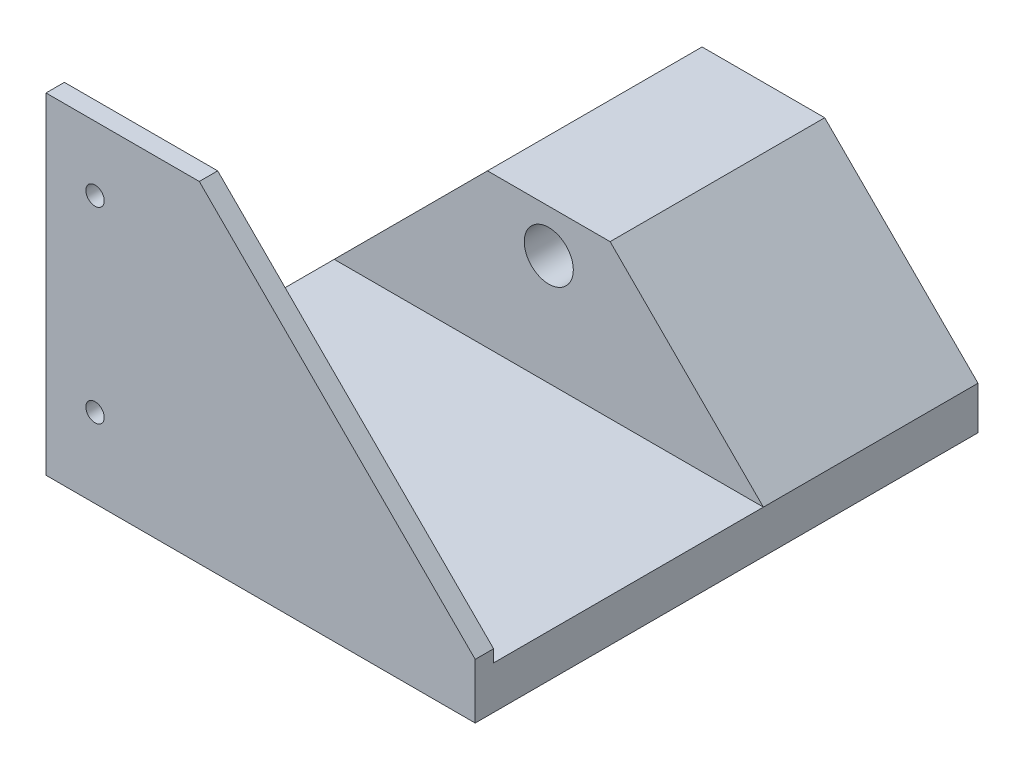
ISO-10303-21;
HEADER;
FILE_DESCRIPTION(('STEP AP214'),'2;1');
FILE_NAME('part.step','',(''),(''),'','','');
FILE_SCHEMA(('AUTOMOTIVE_DESIGN { 1 0 10303 214 1 1 1 1 }'));
ENDSEC;
DATA;
#1=APPLICATION_CONTEXT('core data for automotive mechanical design processes');
#2=APPLICATION_PROTOCOL_DEFINITION('international standard','automotive_design',2000,#1);
#3=PRODUCT_CONTEXT('',#1,'mechanical');
#4=PRODUCT('Part','Part','',(#3));
#5=PRODUCT_RELATED_PRODUCT_CATEGORY('part','',(#4));
#6=PRODUCT_DEFINITION_FORMATION('','',#4);
#7=PRODUCT_DEFINITION_CONTEXT('part definition',#1,'design');
#8=PRODUCT_DEFINITION('design','',#6,#7);
#9=PRODUCT_DEFINITION_SHAPE('','',#8);
#10=(LENGTH_UNIT() NAMED_UNIT(*) SI_UNIT(.MILLI.,.METRE.));
#11=(NAMED_UNIT(*) PLANE_ANGLE_UNIT() SI_UNIT($,.RADIAN.));
#12=(NAMED_UNIT(*) SI_UNIT($,.STERADIAN.) SOLID_ANGLE_UNIT());
#13=UNCERTAINTY_MEASURE_WITH_UNIT(LENGTH_MEASURE(1.E-05),#10,'distance_accuracy_value','');
#14=(GEOMETRIC_REPRESENTATION_CONTEXT(3) GLOBAL_UNCERTAINTY_ASSIGNED_CONTEXT((#13)) GLOBAL_UNIT_ASSIGNED_CONTEXT((#10,
#11,#12)) REPRESENTATION_CONTEXT('',''));
#15=CARTESIAN_POINT('',(0.,0.,0.));
#16=DIRECTION('',(0.,0.,1.));
#17=DIRECTION('',(1.,0.,0.));
#18=AXIS2_PLACEMENT_3D('',#15,#16,#17);
#19=CARTESIAN_POINT('',(-35.,6.99999999999991,64.5));
#20=DIRECTION('',(0.,-1.,0.));
#21=DIRECTION('',(0.,0.,-1.));
#22=AXIS2_PLACEMENT_3D('',#19,#20,#21);
#23=PLANE('',#22);
#24=DIRECTION('',(-1.,0.,0.));
#25=VECTOR('',#24,1.);
#26=CARTESIAN_POINT('',(-35.,6.99999999999991,61.5));
#27=LINE('',#26,#25);
#28=CARTESIAN_POINT('',(35.,6.99999999999991,61.5));
#29=VERTEX_POINT('',#28);
#30=CARTESIAN_POINT('',(-35.,6.99999999999991,61.5));
#31=VERTEX_POINT('',#30);
#32=EDGE_CURVE('E137',#29,#31,#27,.T.);
#33=ORIENTED_EDGE('',*,*,#32,.F.);
#34=DIRECTION('',(0.,0.,-1.));
#35=VECTOR('',#34,1.);
#36=CARTESIAN_POINT('',(35.,6.99999999999991,64.5));
#37=LINE('',#36,#35);
#38=CARTESIAN_POINT('',(35.,6.99999999999991,17.5));
#39=VERTEX_POINT('',#38);
#40=EDGE_CURVE('E157',#29,#39,#37,.T.);
#41=ORIENTED_EDGE('',*,*,#40,.T.);
#42=DIRECTION('',(-1.,0.,0.));
#43=VECTOR('',#42,1.);
#44=CARTESIAN_POINT('',(-35.,6.99999999999991,17.5));
#45=LINE('',#44,#43);
#46=CARTESIAN_POINT('',(-35.,6.99999999999991,17.5));
#47=VERTEX_POINT('',#46);
#48=EDGE_CURVE('E124',#39,#47,#45,.T.);
#49=ORIENTED_EDGE('',*,*,#48,.T.);
#50=DIRECTION('',(0.,0.,-1.));
#51=VECTOR('',#50,1.);
#52=CARTESIAN_POINT('',(-35.,6.99999999999991,64.5));
#53=LINE('',#52,#51);
#54=EDGE_CURVE('E153',#31,#47,#53,.T.);
#55=ORIENTED_EDGE('',*,*,#54,.F.);
#56=EDGE_LOOP('',(#33,#41,#49,#55));
#57=FACE_BOUND('',#56,.T.);
#58=ADVANCED_FACE('F35',(#57),#23,.F.);
#59=CARTESIAN_POINT('',(-35.,32.,17.5));
#60=DIRECTION('',(0.,0.,-1.));
#61=DIRECTION('',(-1.,0.,0.));
#62=AXIS2_PLACEMENT_3D('',#59,#60,#61);
#63=PLANE('',#62);
#64=CARTESIAN_POINT('',(0.,25.,17.5));
#65=DIRECTION('',(0.,0.,1.));
#66=DIRECTION('',(1.,0.,0.));
#67=AXIS2_PLACEMENT_3D('',#64,#65,#66);
#68=CIRCLE('',#67,4.);
#69=CARTESIAN_POINT('',(4.,25.,17.5));
#70=VERTEX_POINT('',#69);
#71=EDGE_CURVE('E159',#70,#70,#68,.T.);
#72=ORIENTED_EDGE('',*,*,#71,.F.);
#73=EDGE_LOOP('',(#72));
#74=FACE_BOUND('',#73,.T.);
#75=ORIENTED_EDGE('',*,*,#48,.F.);
#76=DIRECTION('',(0.707106781186546,-0.707106781186549,0.));
#77=VECTOR('',#76,1.);
#78=CARTESIAN_POINT('',(10.,32.,17.5));
#79=LINE('',#78,#77);
#80=CARTESIAN_POINT('',(10.,32.,17.5));
#81=VERTEX_POINT('',#80);
#82=EDGE_CURVE('E188',#39,#81,#79,.F.);
#83=ORIENTED_EDGE('',*,*,#82,.T.);
#84=DIRECTION('',(1.,0.,0.));
#85=VECTOR('',#84,1.);
#86=CARTESIAN_POINT('',(-35.,32.,17.5));
#87=LINE('',#86,#85);
#88=CARTESIAN_POINT('',(-9.99999999999999,32.,17.5));
#89=VERTEX_POINT('',#88);
#90=EDGE_CURVE('E169',#89,#81,#87,.T.);
#91=ORIENTED_EDGE('',*,*,#90,.F.);
#92=DIRECTION('',(0.707106781186546,0.707106781186549,0.));
#93=VECTOR('',#92,1.);
#94=CARTESIAN_POINT('',(-9.99999999999999,32.,17.5));
#95=LINE('',#94,#93);
#96=EDGE_CURVE('E190',#89,#47,#95,.F.);
#97=ORIENTED_EDGE('',*,*,#96,.T.);
#98=EDGE_LOOP('',(#75,#83,#91,#97));
#99=FACE_BOUND('',#98,.T.);
#100=ADVANCED_FACE('F219',(#74,#99),#63,.F.);
#101=CARTESIAN_POINT('',(35.,32.,17.5));
#102=DIRECTION('',(-1.,0.,0.));
#103=DIRECTION('',(0.,0.,1.));
#104=AXIS2_PLACEMENT_3D('',#101,#102,#103);
#105=PLANE('',#104);
#106=DIRECTION('',(0.,-1.,0.));
#107=VECTOR('',#106,1.);
#108=CARTESIAN_POINT('',(35.,53.9999999999999,61.5));
#109=LINE('',#108,#107);
#110=CARTESIAN_POINT('',(35.,8.99999999999974,61.5));
#111=VERTEX_POINT('',#110);
#112=EDGE_CURVE('E148',#111,#29,#109,.T.);
#113=ORIENTED_EDGE('',*,*,#112,.F.);
#114=DIRECTION('',(0.,0.,1.));
#115=VECTOR('',#114,1.);
#116=CARTESIAN_POINT('',(35.,8.99999999999974,17.5));
#117=LINE('',#116,#115);
#118=CARTESIAN_POINT('',(35.,8.99999999999974,64.5));
#119=VERTEX_POINT('',#118);
#120=EDGE_CURVE('E44',#111,#119,#117,.T.);
#121=ORIENTED_EDGE('',*,*,#120,.T.);
#122=DIRECTION('',(0.,1.,0.));
#123=VECTOR('',#122,1.);
#124=CARTESIAN_POINT('',(35.,6.99999999999991,64.5));
#125=LINE('',#124,#123);
#126=CARTESIAN_POINT('',(35.,0.,64.5));
#127=VERTEX_POINT('',#126);
#128=EDGE_CURVE('E151',#127,#119,#125,.T.);
#129=ORIENTED_EDGE('',*,*,#128,.F.);
#130=DIRECTION('',(0.,0.,-1.));
#131=VECTOR('',#130,1.);
#132=CARTESIAN_POINT('',(35.,0.,17.5));
#133=LINE('',#132,#131);
#134=CARTESIAN_POINT('',(35.,0.,-17.5));
#135=VERTEX_POINT('',#134);
#136=EDGE_CURVE('E165',#127,#135,#133,.T.);
#137=ORIENTED_EDGE('',*,*,#136,.T.);
#138=DIRECTION('',(0.,-1.,0.));
#139=VECTOR('',#138,1.);
#140=CARTESIAN_POINT('',(35.,32.,-17.5));
#141=LINE('',#140,#139);
#142=CARTESIAN_POINT('',(35.,6.99999999999991,-17.5));
#143=VERTEX_POINT('',#142);
#144=EDGE_CURVE('E180',#143,#135,#141,.T.);
#145=ORIENTED_EDGE('',*,*,#144,.F.);
#146=DIRECTION('',(0.,0.,1.));
#147=VECTOR('',#146,1.);
#148=CARTESIAN_POINT('',(35.,6.99999999999991,17.5));
#149=LINE('',#148,#147);
#150=EDGE_CURVE('E199',#143,#39,#149,.T.);
#151=ORIENTED_EDGE('',*,*,#150,.T.);
#152=ORIENTED_EDGE('',*,*,#40,.F.);
#153=EDGE_LOOP('',(#113,#121,#129,#137,#145,#151,#152));
#154=FACE_BOUND('',#153,.T.);
#155=ADVANCED_FACE('F224',(#154),#105,.F.);
#156=CARTESIAN_POINT('',(-35.,32.,-17.5));
#157=DIRECTION('',(0.,0.,1.));
#158=DIRECTION('',(1.,0.,0.));
#159=AXIS2_PLACEMENT_3D('',#156,#157,#158);
#160=PLANE('',#159);
#161=CARTESIAN_POINT('',(0.,25.,-17.5));
#162=DIRECTION('',(0.,0.,1.));
#163=DIRECTION('',(1.,0.,0.));
#164=AXIS2_PLACEMENT_3D('',#161,#162,#163);
#165=CIRCLE('',#164,4.);
#166=CARTESIAN_POINT('',(4.,25.,-17.5));
#167=VERTEX_POINT('',#166);
#168=EDGE_CURVE('E162',#167,#167,#165,.T.);
#169=ORIENTED_EDGE('',*,*,#168,.T.);
#170=EDGE_LOOP('',(#169));
#171=FACE_BOUND('',#170,.T.);
#172=DIRECTION('',(0.,-1.,0.));
#173=VECTOR('',#172,1.);
#174=CARTESIAN_POINT('',(-35.,32.,-17.5));
#175=LINE('',#174,#173);
#176=CARTESIAN_POINT('',(-35.,6.99999999999991,-17.5));
#177=VERTEX_POINT('',#176);
#178=CARTESIAN_POINT('',(-35.,0.,-17.5));
#179=VERTEX_POINT('',#178);
#180=EDGE_CURVE('E172',#177,#179,#175,.T.);
#181=ORIENTED_EDGE('',*,*,#180,.F.);
#182=DIRECTION('',(-0.707106781186546,-0.707106781186549,0.));
#183=VECTOR('',#182,1.);
#184=CARTESIAN_POINT('',(-9.99999999999999,32.,-17.5));
#185=LINE('',#184,#183);
#186=CARTESIAN_POINT('',(-9.99999999999999,32.,-17.5));
#187=VERTEX_POINT('',#186);
#188=EDGE_CURVE('E197',#177,#187,#185,.F.);
#189=ORIENTED_EDGE('',*,*,#188,.T.);
#190=DIRECTION('',(-1.,0.,0.));
#191=VECTOR('',#190,1.);
#192=CARTESIAN_POINT('',(-35.,32.,-17.5));
#193=LINE('',#192,#191);
#194=CARTESIAN_POINT('',(10.,32.,-17.5));
#195=VERTEX_POINT('',#194);
#196=EDGE_CURVE('E166',#195,#187,#193,.T.);
#197=ORIENTED_EDGE('',*,*,#196,.F.);
#198=DIRECTION('',(-0.707106781186546,0.707106781186549,0.));
#199=VECTOR('',#198,1.);
#200=CARTESIAN_POINT('',(10.,32.,-17.5));
#201=LINE('',#200,#199);
#202=EDGE_CURVE('E195',#195,#143,#201,.F.);
#203=ORIENTED_EDGE('',*,*,#202,.T.);
#204=ORIENTED_EDGE('',*,*,#144,.T.);
#205=DIRECTION('',(-1.,0.,0.));
#206=VECTOR('',#205,1.);
#207=CARTESIAN_POINT('',(-35.,0.,-17.5));
#208=LINE('',#207,#206);
#209=EDGE_CURVE('E175',#135,#179,#208,.T.);
#210=ORIENTED_EDGE('',*,*,#209,.T.);
#211=EDGE_LOOP('',(#181,#189,#197,#203,#204,#210));
#212=FACE_BOUND('',#211,.T.);
#213=ADVANCED_FACE('F234',(#171,#212),#160,.F.);
#214=CARTESIAN_POINT('',(-35.,32.,17.5));
#215=DIRECTION('',(1.,0.,0.));
#216=DIRECTION('',(0.,0.,-1.));
#217=AXIS2_PLACEMENT_3D('',#214,#215,#216);
#218=PLANE('',#217);
#219=DIRECTION('',(0.,0.,1.));
#220=VECTOR('',#219,1.);
#221=CARTESIAN_POINT('',(-35.,0.,17.5));
#222=LINE('',#221,#220);
#223=CARTESIAN_POINT('',(-35.,0.,64.5));
#224=VERTEX_POINT('',#223);
#225=EDGE_CURVE('E119',#179,#224,#222,.T.);
#226=ORIENTED_EDGE('',*,*,#225,.T.);
#227=DIRECTION('',(0.,-1.,0.));
#228=VECTOR('',#227,1.);
#229=CARTESIAN_POINT('',(-35.,6.99999999999991,64.5));
#230=LINE('',#229,#228);
#231=CARTESIAN_POINT('',(-35.,53.9999999999999,64.5));
#232=VERTEX_POINT('',#231);
#233=EDGE_CURVE('E112',#232,#224,#230,.T.);
#234=ORIENTED_EDGE('',*,*,#233,.F.);
#235=DIRECTION('',(0.,0.,1.));
#236=VECTOR('',#235,1.);
#237=CARTESIAN_POINT('',(-35.,53.9999999999999,64.5));
#238=LINE('',#237,#236);
#239=CARTESIAN_POINT('',(-35.,53.9999999999999,61.5));
#240=VERTEX_POINT('',#239);
#241=EDGE_CURVE('E117',#240,#232,#238,.T.);
#242=ORIENTED_EDGE('',*,*,#241,.F.);
#243=DIRECTION('',(0.,-1.,0.));
#244=VECTOR('',#243,1.);
#245=CARTESIAN_POINT('',(-35.,53.9999999999999,61.5));
#246=LINE('',#245,#244);
#247=EDGE_CURVE('E145',#240,#31,#246,.T.);
#248=ORIENTED_EDGE('',*,*,#247,.T.);
#249=ORIENTED_EDGE('',*,*,#54,.T.);
#250=DIRECTION('',(0.,0.,-1.));
#251=VECTOR('',#250,1.);
#252=CARTESIAN_POINT('',(-35.,6.99999999999991,17.5));
#253=LINE('',#252,#251);
#254=EDGE_CURVE('E193',#47,#177,#253,.T.);
#255=ORIENTED_EDGE('',*,*,#254,.T.);
#256=ORIENTED_EDGE('',*,*,#180,.T.);
#257=EDGE_LOOP('',(#226,#234,#242,#248,#249,#255,#256));
#258=FACE_BOUND('',#257,.T.);
#259=ADVANCED_FACE('F114',(#258),#218,.F.);
#260=CARTESIAN_POINT('',(0.,32.,0.));
#261=DIRECTION('',(0.,-1.,0.));
#262=DIRECTION('',(0.,0.,-1.));
#263=AXIS2_PLACEMENT_3D('',#260,#261,#262);
#264=PLANE('',#263);
#265=ORIENTED_EDGE('',*,*,#196,.T.);
#266=DIRECTION('',(0.,0.,1.));
#267=VECTOR('',#266,1.);
#268=CARTESIAN_POINT('',(-9.99999999999999,32.,0.));
#269=LINE('',#268,#267);
#270=EDGE_CURVE('E185',#187,#89,#269,.T.);
#271=ORIENTED_EDGE('',*,*,#270,.T.);
#272=ORIENTED_EDGE('',*,*,#90,.T.);
#273=DIRECTION('',(0.,0.,-1.));
#274=VECTOR('',#273,1.);
#275=CARTESIAN_POINT('',(10.,32.,0.));
#276=LINE('',#275,#274);
#277=EDGE_CURVE('E182',#81,#195,#276,.T.);
#278=ORIENTED_EDGE('',*,*,#277,.T.);
#279=EDGE_LOOP('',(#265,#271,#272,#278));
#280=FACE_BOUND('',#279,.T.);
#281=ADVANCED_FACE('F230',(#280),#264,.F.);
#282=CARTESIAN_POINT('',(0.,0.,0.));
#283=DIRECTION('',(0.,-1.,0.));
#284=DIRECTION('',(0.,0.,-1.));
#285=AXIS2_PLACEMENT_3D('',#282,#283,#284);
#286=PLANE('',#285);
#287=ORIENTED_EDGE('',*,*,#136,.F.);
#288=DIRECTION('',(1.,0.,0.));
#289=VECTOR('',#288,1.);
#290=CARTESIAN_POINT('',(-35.,0.,64.5));
#291=LINE('',#290,#289);
#292=EDGE_CURVE('E123',#224,#127,#291,.T.);
#293=ORIENTED_EDGE('',*,*,#292,.F.);
#294=ORIENTED_EDGE('',*,*,#225,.F.);
#295=ORIENTED_EDGE('',*,*,#209,.F.);
#296=EDGE_LOOP('',(#287,#293,#294,#295));
#297=FACE_BOUND('',#296,.T.);
#298=ADVANCED_FACE('F240',(#297),#286,.T.);
#299=CARTESIAN_POINT('',(0.,25.,-22.5));
#300=DIRECTION('',(0.,0.,1.));
#301=DIRECTION('',(1.,0.,0.));
#302=AXIS2_PLACEMENT_3D('',#299,#300,#301);
#303=CYLINDRICAL_SURFACE('',#302,4.);
#304=ORIENTED_EDGE('',*,*,#71,.T.);
#305=EDGE_LOOP('',(#304));
#306=FACE_BOUND('',#305,.T.);
#307=ORIENTED_EDGE('',*,*,#168,.F.);
#308=EDGE_LOOP('',(#307));
#309=FACE_BOUND('',#308,.T.);
#310=ADVANCED_FACE('F259',(#306,#309),#303,.F.);
#311=CARTESIAN_POINT('',(-9.99999999999999,32.,0.));
#312=DIRECTION('',(0.707106781186549,-0.707106781186546,0.));
#313=DIRECTION('',(0.,0.,1.));
#314=AXIS2_PLACEMENT_3D('',#311,#312,#313);
#315=PLANE('',#314);
#316=ORIENTED_EDGE('',*,*,#188,.F.);
#317=ORIENTED_EDGE('',*,*,#254,.F.);
#318=ORIENTED_EDGE('',*,*,#96,.F.);
#319=ORIENTED_EDGE('',*,*,#270,.F.);
#320=EDGE_LOOP('',(#316,#317,#318,#319));
#321=FACE_BOUND('',#320,.T.);
#322=ADVANCED_FACE('F237',(#321),#315,.F.);
#323=CARTESIAN_POINT('',(10.,32.,0.));
#324=DIRECTION('',(-0.707106781186549,-0.707106781186546,0.));
#325=DIRECTION('',(0.,0.,-1.));
#326=AXIS2_PLACEMENT_3D('',#323,#324,#325);
#327=PLANE('',#326);
#328=ORIENTED_EDGE('',*,*,#82,.F.);
#329=ORIENTED_EDGE('',*,*,#150,.F.);
#330=ORIENTED_EDGE('',*,*,#202,.F.);
#331=ORIENTED_EDGE('',*,*,#277,.F.);
#332=EDGE_LOOP('',(#328,#329,#330,#331));
#333=FACE_BOUND('',#332,.T.);
#334=ADVANCED_FACE('F227',(#333),#327,.F.);
#335=CARTESIAN_POINT('',(0.,0.,64.5));
#336=DIRECTION('',(0.,0.,1.));
#337=DIRECTION('',(1.,0.,0.));
#338=AXIS2_PLACEMENT_3D('',#335,#336,#337);
#339=PLANE('',#338);
#340=CARTESIAN_POINT('',(-27.,12.9,64.5));
#341=DIRECTION('',(0.,0.,1.));
#342=DIRECTION('',(1.,0.,0.));
#343=AXIS2_PLACEMENT_3D('',#340,#341,#342);
#344=CIRCLE('',#343,1.5);
#345=CARTESIAN_POINT('',(-25.5,12.9,64.5));
#346=VERTEX_POINT('',#345);
#347=EDGE_CURVE('E206',#346,#346,#344,.T.);
#348=ORIENTED_EDGE('',*,*,#347,.F.);
#349=EDGE_LOOP('',(#348));
#350=FACE_BOUND('',#349,.T.);
#351=CARTESIAN_POINT('',(-27.,43.5,64.5));
#352=DIRECTION('',(0.,0.,1.));
#353=DIRECTION('',(1.,0.,0.));
#354=AXIS2_PLACEMENT_3D('',#351,#352,#353);
#355=CIRCLE('',#354,1.5);
#356=CARTESIAN_POINT('',(-25.5,43.5,64.5));
#357=VERTEX_POINT('',#356);
#358=EDGE_CURVE('E142',#357,#357,#355,.T.);
#359=ORIENTED_EDGE('',*,*,#358,.F.);
#360=EDGE_LOOP('',(#359));
#361=FACE_BOUND('',#360,.T.);
#362=ORIENTED_EDGE('',*,*,#128,.T.);
#363=DIRECTION('',(0.707106781186546,-0.707106781186549,0.));
#364=VECTOR('',#363,1.);
#365=CARTESIAN_POINT('',(21.9999999999999,21.9999999999999,64.5));
#366=LINE('',#365,#364);
#367=CARTESIAN_POINT('',(-9.99999999999997,53.9999999999999,64.5));
#368=VERTEX_POINT('',#367);
#369=EDGE_CURVE('E11',#119,#368,#366,.F.);
#370=ORIENTED_EDGE('',*,*,#369,.T.);
#371=DIRECTION('',(1.,0.,0.));
#372=VECTOR('',#371,1.);
#373=CARTESIAN_POINT('',(-35.,53.9999999999999,64.5));
#374=LINE('',#373,#372);
#375=EDGE_CURVE('E127',#232,#368,#374,.T.);
#376=ORIENTED_EDGE('',*,*,#375,.F.);
#377=ORIENTED_EDGE('',*,*,#233,.T.);
#378=ORIENTED_EDGE('',*,*,#292,.T.);
#379=EDGE_LOOP('',(#362,#370,#376,#377,#378));
#380=FACE_BOUND('',#379,.T.);
#381=ADVANCED_FACE('F128',(#350,#361,#380),#339,.T.);
#382=CARTESIAN_POINT('',(-35.,53.9999999999999,61.5));
#383=DIRECTION('',(0.,0.,1.));
#384=DIRECTION('',(1.,0.,0.));
#385=AXIS2_PLACEMENT_3D('',#382,#383,#384);
#386=PLANE('',#385);
#387=CARTESIAN_POINT('',(-27.,12.9,61.5));
#388=DIRECTION('',(0.,0.,1.));
#389=DIRECTION('',(1.,0.,0.));
#390=AXIS2_PLACEMENT_3D('',#387,#388,#389);
#391=CIRCLE('',#390,1.5);
#392=CARTESIAN_POINT('',(-25.5,12.9,61.5));
#393=VERTEX_POINT('',#392);
#394=EDGE_CURVE('E139',#393,#393,#391,.T.);
#395=ORIENTED_EDGE('',*,*,#394,.T.);
#396=EDGE_LOOP('',(#395));
#397=FACE_BOUND('',#396,.T.);
#398=CARTESIAN_POINT('',(-27.,43.5,61.5));
#399=DIRECTION('',(0.,0.,1.));
#400=DIRECTION('',(1.,0.,0.));
#401=AXIS2_PLACEMENT_3D('',#398,#399,#400);
#402=CIRCLE('',#401,1.5);
#403=CARTESIAN_POINT('',(-25.5,43.5,61.5));
#404=VERTEX_POINT('',#403);
#405=EDGE_CURVE('E203',#404,#404,#402,.T.);
#406=ORIENTED_EDGE('',*,*,#405,.T.);
#407=EDGE_LOOP('',(#406));
#408=FACE_BOUND('',#407,.T.);
#409=DIRECTION('',(-1.,0.,0.));
#410=VECTOR('',#409,1.);
#411=CARTESIAN_POINT('',(-35.,53.9999999999999,61.5));
#412=LINE('',#411,#410);
#413=CARTESIAN_POINT('',(-9.99999999999997,53.9999999999999,61.5));
#414=VERTEX_POINT('',#413);
#415=EDGE_CURVE('E133',#414,#240,#412,.T.);
#416=ORIENTED_EDGE('',*,*,#415,.F.);
#417=DIRECTION('',(-0.707106781186546,0.707106781186549,0.));
#418=VECTOR('',#417,1.);
#419=CARTESIAN_POINT('',(-9.99999999999997,53.9999999999999,61.5));
#420=LINE('',#419,#418);
#421=EDGE_CURVE('E58',#414,#111,#420,.F.);
#422=ORIENTED_EDGE('',*,*,#421,.T.);
#423=ORIENTED_EDGE('',*,*,#112,.T.);
#424=ORIENTED_EDGE('',*,*,#32,.T.);
#425=ORIENTED_EDGE('',*,*,#247,.F.);
#426=EDGE_LOOP('',(#416,#422,#423,#424,#425));
#427=FACE_BOUND('',#426,.T.);
#428=ADVANCED_FACE('F211',(#397,#408,#427),#386,.F.);
#429=CARTESIAN_POINT('',(0.,53.9999999999999,0.));
#430=DIRECTION('',(0.,-1.,0.));
#431=DIRECTION('',(0.,0.,-1.));
#432=AXIS2_PLACEMENT_3D('',#429,#430,#431);
#433=PLANE('',#432);
#434=ORIENTED_EDGE('',*,*,#375,.T.);
#435=DIRECTION('',(0.,0.,-1.));
#436=VECTOR('',#435,1.);
#437=CARTESIAN_POINT('',(-9.99999999999997,53.9999999999999,0.));
#438=LINE('',#437,#436);
#439=EDGE_CURVE('E202',#368,#414,#438,.T.);
#440=ORIENTED_EDGE('',*,*,#439,.T.);
#441=ORIENTED_EDGE('',*,*,#415,.T.);
#442=ORIENTED_EDGE('',*,*,#241,.T.);
#443=EDGE_LOOP('',(#434,#440,#441,#442));
#444=FACE_BOUND('',#443,.T.);
#445=ADVANCED_FACE('F135',(#444),#433,.F.);
#446=CARTESIAN_POINT('',(-27.,43.5,54.5));
#447=DIRECTION('',(0.,0.,1.));
#448=DIRECTION('',(1.,0.,0.));
#449=AXIS2_PLACEMENT_3D('',#446,#447,#448);
#450=CYLINDRICAL_SURFACE('',#449,1.5);
#451=ORIENTED_EDGE('',*,*,#358,.T.);
#452=EDGE_LOOP('',(#451));
#453=FACE_BOUND('',#452,.T.);
#454=ORIENTED_EDGE('',*,*,#405,.F.);
#455=EDGE_LOOP('',(#454));
#456=FACE_BOUND('',#455,.T.);
#457=ADVANCED_FACE('F246',(#453,#456),#450,.F.);
#458=CARTESIAN_POINT('',(-27.,12.9,54.5));
#459=DIRECTION('',(0.,0.,1.));
#460=DIRECTION('',(1.,0.,0.));
#461=AXIS2_PLACEMENT_3D('',#458,#459,#460);
#462=CYLINDRICAL_SURFACE('',#461,1.5);
#463=ORIENTED_EDGE('',*,*,#347,.T.);
#464=EDGE_LOOP('',(#463));
#465=FACE_BOUND('',#464,.T.);
#466=ORIENTED_EDGE('',*,*,#394,.F.);
#467=EDGE_LOOP('',(#466));
#468=FACE_BOUND('',#467,.T.);
#469=ADVANCED_FACE('F242',(#465,#468),#462,.F.);
#470=CARTESIAN_POINT('',(-9.99999999999997,53.9999999999999,0.));
#471=DIRECTION('',(-0.707106781186549,-0.707106781186546,0.));
#472=DIRECTION('',(0.,0.,-1.));
#473=AXIS2_PLACEMENT_3D('',#470,#471,#472);
#474=PLANE('',#473);
#475=ORIENTED_EDGE('',*,*,#369,.F.);
#476=ORIENTED_EDGE('',*,*,#120,.F.);
#477=ORIENTED_EDGE('',*,*,#421,.F.);
#478=ORIENTED_EDGE('',*,*,#439,.F.);
#479=EDGE_LOOP('',(#475,#476,#477,#478));
#480=FACE_BOUND('',#479,.T.);
#481=ADVANCED_FACE('F38',(#480),#474,.F.);
#482=CLOSED_SHELL('',(#58,#100,#155,#213,#259,#281,#298,#310,#322,#334,#381,#428,#445,#457,#469,#481));
#483=MANIFOLD_SOLID_BREP('B2',#482);
#484=ADVANCED_BREP_SHAPE_REPRESENTATION('',(#18,#483),#14);
#485=SHAPE_DEFINITION_REPRESENTATION(#9,#484);
ENDSEC;
END-ISO-10303-21;
